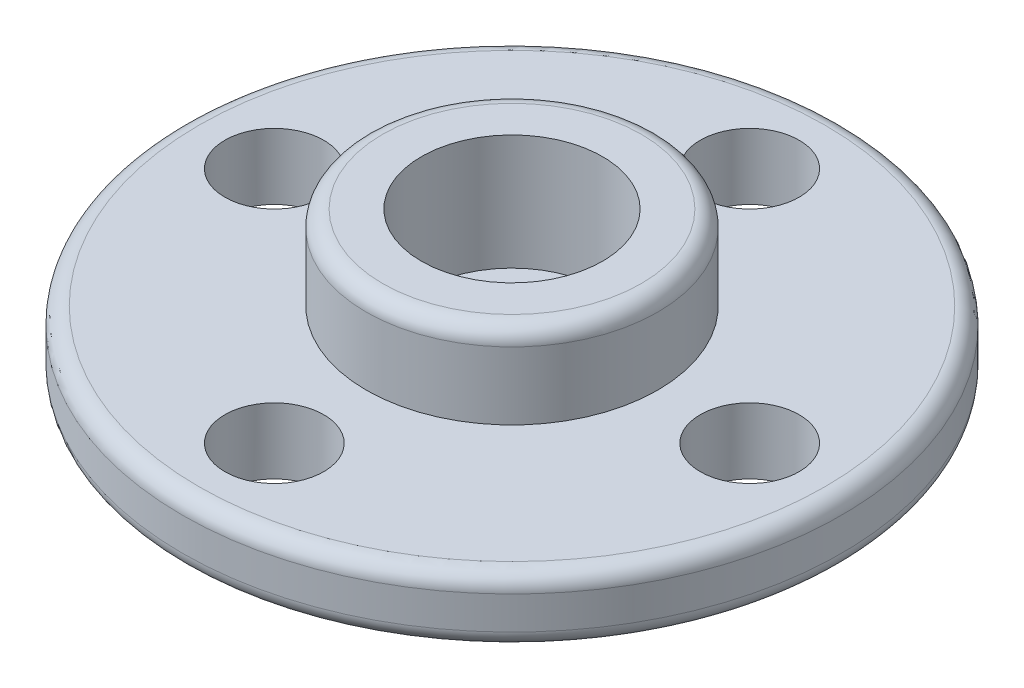
ISO-10303-21;
HEADER;
FILE_DESCRIPTION(('STEP AP214'),'2;1');
FILE_NAME('part.step','',(''),(''),'','','');
FILE_SCHEMA(('AUTOMOTIVE_DESIGN { 1 0 10303 214 1 1 1 1 }'));
ENDSEC;
DATA;
#1=APPLICATION_CONTEXT('core data for automotive mechanical design processes');
#2=APPLICATION_PROTOCOL_DEFINITION('international standard','automotive_design',2000,#1);
#3=PRODUCT_CONTEXT('',#1,'mechanical');
#4=PRODUCT('Part','Part','',(#3));
#5=PRODUCT_RELATED_PRODUCT_CATEGORY('part','',(#4));
#6=PRODUCT_DEFINITION_FORMATION('','',#4);
#7=PRODUCT_DEFINITION_CONTEXT('part definition',#1,'design');
#8=PRODUCT_DEFINITION('design','',#6,#7);
#9=PRODUCT_DEFINITION_SHAPE('','',#8);
#10=(LENGTH_UNIT() NAMED_UNIT(*) SI_UNIT(.MILLI.,.METRE.));
#11=(NAMED_UNIT(*) PLANE_ANGLE_UNIT() SI_UNIT($,.RADIAN.));
#12=(NAMED_UNIT(*) SI_UNIT($,.STERADIAN.) SOLID_ANGLE_UNIT());
#13=UNCERTAINTY_MEASURE_WITH_UNIT(LENGTH_MEASURE(1.E-05),#10,'distance_accuracy_value','');
#14=(GEOMETRIC_REPRESENTATION_CONTEXT(3) GLOBAL_UNCERTAINTY_ASSIGNED_CONTEXT((#13)) GLOBAL_UNIT_ASSIGNED_CONTEXT((#10,
#11,#12)) REPRESENTATION_CONTEXT('',''));
#15=CARTESIAN_POINT('',(0.,0.,0.));
#16=DIRECTION('',(0.,0.,1.));
#17=DIRECTION('',(1.,0.,0.));
#18=AXIS2_PLACEMENT_3D('',#15,#16,#17);
#19=CARTESIAN_POINT('',(0.,2.,0.));
#20=DIRECTION('',(0.,1.,0.));
#21=DIRECTION('',(0.,0.,1.));
#22=AXIS2_PLACEMENT_3D('',#19,#20,#21);
#23=PLANE('',#22);
#24=CARTESIAN_POINT('',(0.,2.,0.));
#25=DIRECTION('',(0.,1.,0.));
#26=DIRECTION('',(0.,0.,1.));
#27=AXIS2_PLACEMENT_3D('',#24,#25,#26);
#28=CIRCLE('',#27,9.5);
#29=CARTESIAN_POINT('',(0.,2.,9.5));
#30=VERTEX_POINT('',#29);
#31=EDGE_CURVE('E46',#30,#30,#28,.T.);
#32=ORIENTED_EDGE('',*,*,#31,.T.);
#33=EDGE_LOOP('',(#32));
#34=FACE_BOUND('',#33,.T.);
#35=CARTESIAN_POINT('',(-7.2125,2.,0.));
#36=DIRECTION('',(0.,1.,0.));
#37=DIRECTION('',(0.,0.,1.));
#38=AXIS2_PLACEMENT_3D('',#35,#36,#37);
#39=CIRCLE('',#38,1.5);
#40=CARTESIAN_POINT('',(-7.2125,2.,1.50000000000003));
#41=VERTEX_POINT('',#40);
#42=EDGE_CURVE('E78',#41,#41,#39,.T.);
#43=ORIENTED_EDGE('',*,*,#42,.F.);
#44=EDGE_LOOP('',(#43));
#45=FACE_BOUND('',#44,.T.);
#46=CARTESIAN_POINT('',(0.,2.,7.2125));
#47=DIRECTION('',(0.,1.,0.));
#48=DIRECTION('',(0.,0.,1.));
#49=AXIS2_PLACEMENT_3D('',#46,#47,#48);
#50=CIRCLE('',#49,1.5);
#51=CARTESIAN_POINT('',(0.,2.,8.7125));
#52=VERTEX_POINT('',#51);
#53=EDGE_CURVE('E81',#52,#52,#50,.T.);
#54=ORIENTED_EDGE('',*,*,#53,.F.);
#55=EDGE_LOOP('',(#54));
#56=FACE_BOUND('',#55,.T.);
#57=CARTESIAN_POINT('',(7.2125,2.,0.));
#58=DIRECTION('',(0.,1.,0.));
#59=DIRECTION('',(0.,0.,1.));
#60=AXIS2_PLACEMENT_3D('',#57,#58,#59);
#61=CIRCLE('',#60,1.5);
#62=CARTESIAN_POINT('',(7.2125,2.,1.49999999999992));
#63=VERTEX_POINT('',#62);
#64=EDGE_CURVE('E84',#63,#63,#61,.T.);
#65=ORIENTED_EDGE('',*,*,#64,.F.);
#66=EDGE_LOOP('',(#65));
#67=FACE_BOUND('',#66,.T.);
#68=CARTESIAN_POINT('',(0.,2.,-7.2125));
#69=DIRECTION('',(0.,1.,0.));
#70=DIRECTION('',(0.,0.,1.));
#71=AXIS2_PLACEMENT_3D('',#68,#69,#70);
#72=CIRCLE('',#71,1.5);
#73=CARTESIAN_POINT('',(0.,2.,-5.7125));
#74=VERTEX_POINT('',#73);
#75=EDGE_CURVE('E72',#74,#74,#72,.T.);
#76=ORIENTED_EDGE('',*,*,#75,.F.);
#77=EDGE_LOOP('',(#76));
#78=FACE_BOUND('',#77,.T.);
#79=CARTESIAN_POINT('',(0.,2.,0.));
#80=DIRECTION('',(0.,1.,0.));
#81=DIRECTION('',(0.,0.,1.));
#82=AXIS2_PLACEMENT_3D('',#79,#80,#81);
#83=CIRCLE('',#82,4.425);
#84=CARTESIAN_POINT('',(0.,2.,4.425));
#85=VERTEX_POINT('',#84);
#86=EDGE_CURVE('E57',#85,#85,#83,.T.);
#87=ORIENTED_EDGE('',*,*,#86,.F.);
#88=EDGE_LOOP('',(#87));
#89=FACE_BOUND('',#88,.T.);
#90=ADVANCED_FACE('F31',(#34,#45,#56,#67,#78,#89),#23,.T.);
#91=CARTESIAN_POINT('',(0.,0.,0.));
#92=DIRECTION('',(0.,1.,0.));
#93=DIRECTION('',(0.,0.,1.));
#94=AXIS2_PLACEMENT_3D('',#91,#92,#93);
#95=PLANE('',#94);
#96=CARTESIAN_POINT('',(0.,0.,0.));
#97=DIRECTION('',(0.,1.,0.));
#98=DIRECTION('',(0.,0.,1.));
#99=AXIS2_PLACEMENT_3D('',#96,#97,#98);
#100=CIRCLE('',#99,9.5);
#101=CARTESIAN_POINT('',(0.,0.,9.5));
#102=VERTEX_POINT('',#101);
#103=EDGE_CURVE('E10',#102,#102,#100,.F.);
#104=ORIENTED_EDGE('',*,*,#103,.T.);
#105=EDGE_LOOP('',(#104));
#106=FACE_BOUND('',#105,.T.);
#107=CARTESIAN_POINT('',(-7.2125,0.,0.));
#108=DIRECTION('',(0.,1.,0.));
#109=DIRECTION('',(1.,0.,0.));
#110=AXIS2_PLACEMENT_3D('',#107,#108,#109);
#111=CIRCLE('',#110,1.5);
#112=CARTESIAN_POINT('',(-5.7125,0.,0.));
#113=VERTEX_POINT('',#112);
#114=EDGE_CURVE('E87',#113,#113,#111,.T.);
#115=ORIENTED_EDGE('',*,*,#114,.T.);
#116=EDGE_LOOP('',(#115));
#117=FACE_BOUND('',#116,.T.);
#118=CARTESIAN_POINT('',(0.,0.,7.2125));
#119=DIRECTION('',(0.,1.,0.));
#120=DIRECTION('',(0.,0.,-1.));
#121=AXIS2_PLACEMENT_3D('',#118,#119,#120);
#122=CIRCLE('',#121,1.5);
#123=CARTESIAN_POINT('',(0.,0.,5.7125));
#124=VERTEX_POINT('',#123);
#125=EDGE_CURVE('E91',#124,#124,#122,.T.);
#126=ORIENTED_EDGE('',*,*,#125,.T.);
#127=EDGE_LOOP('',(#126));
#128=FACE_BOUND('',#127,.T.);
#129=CARTESIAN_POINT('',(7.2125,0.,0.));
#130=DIRECTION('',(0.,1.,0.));
#131=DIRECTION('',(-1.,0.,0.));
#132=AXIS2_PLACEMENT_3D('',#129,#130,#131);
#133=CIRCLE('',#132,1.5);
#134=CARTESIAN_POINT('',(5.7125,0.,0.));
#135=VERTEX_POINT('',#134);
#136=EDGE_CURVE('E88',#135,#135,#133,.T.);
#137=ORIENTED_EDGE('',*,*,#136,.T.);
#138=EDGE_LOOP('',(#137));
#139=FACE_BOUND('',#138,.T.);
#140=CARTESIAN_POINT('',(0.,0.,-7.2125));
#141=DIRECTION('',(0.,1.,0.));
#142=DIRECTION('',(0.,0.,1.));
#143=AXIS2_PLACEMENT_3D('',#140,#141,#142);
#144=CIRCLE('',#143,1.5);
#145=CARTESIAN_POINT('',(0.,0.,-5.7125));
#146=VERTEX_POINT('',#145);
#147=EDGE_CURVE('E75',#146,#146,#144,.T.);
#148=ORIENTED_EDGE('',*,*,#147,.T.);
#149=EDGE_LOOP('',(#148));
#150=FACE_BOUND('',#149,.T.);
#151=CARTESIAN_POINT('',(0.,0.,0.));
#152=DIRECTION('',(0.,1.,0.));
#153=DIRECTION('',(0.,0.,1.));
#154=AXIS2_PLACEMENT_3D('',#151,#152,#153);
#155=CIRCLE('',#154,1.5);
#156=CARTESIAN_POINT('',(0.,0.,1.5));
#157=VERTEX_POINT('',#156);
#158=EDGE_CURVE('E62',#157,#157,#155,.T.);
#159=ORIENTED_EDGE('',*,*,#158,.T.);
#160=EDGE_LOOP('',(#159));
#161=FACE_BOUND('',#160,.T.);
#162=ADVANCED_FACE('F97',(#106,#117,#128,#139,#150,#161),#95,.F.);
#163=CARTESIAN_POINT('',(0.,2.,0.));
#164=DIRECTION('',(0.,-1.,0.));
#165=DIRECTION('',(0.,0.,-1.));
#166=AXIS2_PLACEMENT_3D('',#163,#164,#165);
#167=CYLINDRICAL_SURFACE('',#166,10.);
#168=CARTESIAN_POINT('',(0.,1.5,0.));
#169=DIRECTION('',(0.,1.,0.));
#170=DIRECTION('',(0.,0.,1.));
#171=AXIS2_PLACEMENT_3D('',#168,#169,#170);
#172=CIRCLE('',#171,10.);
#173=CARTESIAN_POINT('',(0.,1.5,10.));
#174=VERTEX_POINT('',#173);
#175=EDGE_CURVE('E38',#174,#174,#172,.F.);
#176=ORIENTED_EDGE('',*,*,#175,.T.);
#177=EDGE_LOOP('',(#176));
#178=FACE_BOUND('',#177,.T.);
#179=CARTESIAN_POINT('',(0.,0.5,0.));
#180=DIRECTION('',(0.,1.,0.));
#181=DIRECTION('',(0.,0.,1.));
#182=AXIS2_PLACEMENT_3D('',#179,#180,#181);
#183=CIRCLE('',#182,10.);
#184=CARTESIAN_POINT('',(0.,0.5,10.));
#185=VERTEX_POINT('',#184);
#186=EDGE_CURVE('E42',#185,#185,#183,.T.);
#187=ORIENTED_EDGE('',*,*,#186,.T.);
#188=EDGE_LOOP('',(#187));
#189=FACE_BOUND('',#188,.T.);
#190=ADVANCED_FACE('F122',(#178,#189),#167,.T.);
#191=CARTESIAN_POINT('',(0.,4.55,0.));
#192=DIRECTION('',(0.,-1.,0.));
#193=DIRECTION('',(0.,0.,-1.));
#194=AXIS2_PLACEMENT_3D('',#191,#192,#193);
#195=CYLINDRICAL_SURFACE('',#194,4.425);
#196=CARTESIAN_POINT('',(0.,4.05,0.));
#197=DIRECTION('',(0.,1.,0.));
#198=DIRECTION('',(0.,0.,1.));
#199=AXIS2_PLACEMENT_3D('',#196,#197,#198);
#200=CIRCLE('',#199,4.425);
#201=CARTESIAN_POINT('',(0.,4.05,4.425));
#202=VERTEX_POINT('',#201);
#203=EDGE_CURVE('E51',#202,#202,#200,.F.);
#204=ORIENTED_EDGE('',*,*,#203,.T.);
#205=EDGE_LOOP('',(#204));
#206=FACE_BOUND('',#205,.T.);
#207=ORIENTED_EDGE('',*,*,#86,.T.);
#208=EDGE_LOOP('',(#207));
#209=FACE_BOUND('',#208,.T.);
#210=ADVANCED_FACE('F126',(#206,#209),#195,.T.);
#211=CARTESIAN_POINT('',(0.,4.55,0.));
#212=DIRECTION('',(0.,1.,0.));
#213=DIRECTION('',(0.,0.,1.));
#214=AXIS2_PLACEMENT_3D('',#211,#212,#213);
#215=PLANE('',#214);
#216=CARTESIAN_POINT('',(0.,4.55,0.));
#217=DIRECTION('',(0.,1.,0.));
#218=DIRECTION('',(0.,0.,1.));
#219=AXIS2_PLACEMENT_3D('',#216,#217,#218);
#220=CIRCLE('',#219,3.925);
#221=CARTESIAN_POINT('',(0.,4.55,3.925));
#222=VERTEX_POINT('',#221);
#223=EDGE_CURVE('E54',#222,#222,#220,.T.);
#224=ORIENTED_EDGE('',*,*,#223,.T.);
#225=EDGE_LOOP('',(#224));
#226=FACE_BOUND('',#225,.T.);
#227=CARTESIAN_POINT('',(0.,4.55,0.));
#228=DIRECTION('',(0.,1.,0.));
#229=DIRECTION('',(0.,0.,1.));
#230=AXIS2_PLACEMENT_3D('',#227,#228,#229);
#231=CIRCLE('',#230,2.75);
#232=CARTESIAN_POINT('',(0.,4.55,2.75));
#233=VERTEX_POINT('',#232);
#234=EDGE_CURVE('E61',#233,#233,#231,.T.);
#235=ORIENTED_EDGE('',*,*,#234,.F.);
#236=EDGE_LOOP('',(#235));
#237=FACE_BOUND('',#236,.T.);
#238=ADVANCED_FACE('F159',(#226,#237),#215,.T.);
#239=CARTESIAN_POINT('',(0.,1.05,0.));
#240=DIRECTION('',(0.,1.,0.));
#241=DIRECTION('',(0.,0.,1.));
#242=AXIS2_PLACEMENT_3D('',#239,#240,#241);
#243=CYLINDRICAL_SURFACE('',#242,2.75);
#244=CARTESIAN_POINT('',(0.,1.05,0.));
#245=DIRECTION('',(0.,1.,0.));
#246=DIRECTION('',(0.,0.,1.));
#247=AXIS2_PLACEMENT_3D('',#244,#245,#246);
#248=CIRCLE('',#247,2.75);
#249=CARTESIAN_POINT('',(0.,1.05,2.75));
#250=VERTEX_POINT('',#249);
#251=EDGE_CURVE('E65',#250,#250,#248,.T.);
#252=ORIENTED_EDGE('',*,*,#251,.F.);
#253=EDGE_LOOP('',(#252));
#254=FACE_BOUND('',#253,.T.);
#255=ORIENTED_EDGE('',*,*,#234,.T.);
#256=EDGE_LOOP('',(#255));
#257=FACE_BOUND('',#256,.T.);
#258=ADVANCED_FACE('F163',(#254,#257),#243,.F.);
#259=CARTESIAN_POINT('',(0.,1.05,0.));
#260=DIRECTION('',(0.,1.,0.));
#261=DIRECTION('',(0.,0.,1.));
#262=AXIS2_PLACEMENT_3D('',#259,#260,#261);
#263=PLANE('',#262);
#264=CARTESIAN_POINT('',(0.,1.05,0.));
#265=DIRECTION('',(0.,1.,0.));
#266=DIRECTION('',(0.,0.,1.));
#267=AXIS2_PLACEMENT_3D('',#264,#265,#266);
#268=CIRCLE('',#267,1.5);
#269=CARTESIAN_POINT('',(0.,1.05,1.5));
#270=VERTEX_POINT('',#269);
#271=EDGE_CURVE('E58',#270,#270,#268,.T.);
#272=ORIENTED_EDGE('',*,*,#271,.F.);
#273=EDGE_LOOP('',(#272));
#274=FACE_BOUND('',#273,.T.);
#275=ORIENTED_EDGE('',*,*,#251,.T.);
#276=EDGE_LOOP('',(#275));
#277=FACE_BOUND('',#276,.T.);
#278=ADVANCED_FACE('F201',(#274,#277),#263,.T.);
#279=CARTESIAN_POINT('',(0.,0.,0.));
#280=DIRECTION('',(0.,1.,0.));
#281=DIRECTION('',(0.,0.,1.));
#282=AXIS2_PLACEMENT_3D('',#279,#280,#281);
#283=CYLINDRICAL_SURFACE('',#282,1.5);
#284=ORIENTED_EDGE('',*,*,#271,.T.);
#285=EDGE_LOOP('',(#284));
#286=FACE_BOUND('',#285,.T.);
#287=ORIENTED_EDGE('',*,*,#158,.F.);
#288=EDGE_LOOP('',(#287));
#289=FACE_BOUND('',#288,.T.);
#290=ADVANCED_FACE('F210',(#286,#289),#283,.F.);
#291=CARTESIAN_POINT('',(0.,0.,-7.2125));
#292=DIRECTION('',(0.,1.,0.));
#293=DIRECTION('',(0.,0.,1.));
#294=AXIS2_PLACEMENT_3D('',#291,#292,#293);
#295=CYLINDRICAL_SURFACE('',#294,1.5);
#296=ORIENTED_EDGE('',*,*,#75,.T.);
#297=EDGE_LOOP('',(#296));
#298=FACE_BOUND('',#297,.T.);
#299=ORIENTED_EDGE('',*,*,#147,.F.);
#300=EDGE_LOOP('',(#299));
#301=FACE_BOUND('',#300,.T.);
#302=ADVANCED_FACE('F219',(#298,#301),#295,.F.);
#303=CARTESIAN_POINT('',(7.2125,0.,0.));
#304=DIRECTION('',(0.,1.,0.));
#305=DIRECTION('',(0.,0.,1.));
#306=AXIS2_PLACEMENT_3D('',#303,#304,#305);
#307=CYLINDRICAL_SURFACE('',#306,1.5);
#308=ORIENTED_EDGE('',*,*,#64,.T.);
#309=EDGE_LOOP('',(#308));
#310=FACE_BOUND('',#309,.T.);
#311=ORIENTED_EDGE('',*,*,#136,.F.);
#312=EDGE_LOOP('',(#311));
#313=FACE_BOUND('',#312,.T.);
#314=ADVANCED_FACE('F113',(#310,#313),#307,.F.);
#315=CARTESIAN_POINT('',(0.,0.,7.2125));
#316=DIRECTION('',(0.,1.,0.));
#317=DIRECTION('',(0.,0.,1.));
#318=AXIS2_PLACEMENT_3D('',#315,#316,#317);
#319=CYLINDRICAL_SURFACE('',#318,1.5);
#320=ORIENTED_EDGE('',*,*,#53,.T.);
#321=EDGE_LOOP('',(#320));
#322=FACE_BOUND('',#321,.T.);
#323=ORIENTED_EDGE('',*,*,#125,.F.);
#324=EDGE_LOOP('',(#323));
#325=FACE_BOUND('',#324,.T.);
#326=ADVANCED_FACE('F103',(#322,#325),#319,.F.);
#327=CARTESIAN_POINT('',(-7.2125,0.,0.));
#328=DIRECTION('',(0.,1.,0.));
#329=DIRECTION('',(0.,0.,1.));
#330=AXIS2_PLACEMENT_3D('',#327,#328,#329);
#331=CYLINDRICAL_SURFACE('',#330,1.5);
#332=ORIENTED_EDGE('',*,*,#42,.T.);
#333=EDGE_LOOP('',(#332));
#334=FACE_BOUND('',#333,.T.);
#335=ORIENTED_EDGE('',*,*,#114,.F.);
#336=EDGE_LOOP('',(#335));
#337=FACE_BOUND('',#336,.T.);
#338=ADVANCED_FACE('F100',(#334,#337),#331,.F.);
#339=CARTESIAN_POINT('',(0.,4.05,0.));
#340=DIRECTION('',(0.,1.,0.));
#341=DIRECTION('',(0.,0.,1.));
#342=AXIS2_PLACEMENT_3D('',#339,#340,#341);
#343=TOROIDAL_SURFACE('',#342,3.925,0.5);
#344=ORIENTED_EDGE('',*,*,#203,.F.);
#345=EDGE_LOOP('',(#344));
#346=FACE_BOUND('',#345,.T.);
#347=ORIENTED_EDGE('',*,*,#223,.F.);
#348=EDGE_LOOP('',(#347));
#349=FACE_BOUND('',#348,.T.);
#350=ADVANCED_FACE('F102',(#346,#349),#343,.T.);
#351=CARTESIAN_POINT('',(0.,1.5,0.));
#352=DIRECTION('',(0.,1.,0.));
#353=DIRECTION('',(0.,0.,1.));
#354=AXIS2_PLACEMENT_3D('',#351,#352,#353);
#355=TOROIDAL_SURFACE('',#354,9.5,0.5);
#356=ORIENTED_EDGE('',*,*,#175,.F.);
#357=EDGE_LOOP('',(#356));
#358=FACE_BOUND('',#357,.T.);
#359=ORIENTED_EDGE('',*,*,#31,.F.);
#360=EDGE_LOOP('',(#359));
#361=FACE_BOUND('',#360,.T.);
#362=ADVANCED_FACE('F110',(#358,#361),#355,.T.);
#363=CARTESIAN_POINT('',(0.,0.5,0.));
#364=DIRECTION('',(0.,1.,0.));
#365=DIRECTION('',(0.,0.,1.));
#366=AXIS2_PLACEMENT_3D('',#363,#364,#365);
#367=TOROIDAL_SURFACE('',#366,9.5,0.5);
#368=ORIENTED_EDGE('',*,*,#103,.F.);
#369=EDGE_LOOP('',(#368));
#370=FACE_BOUND('',#369,.T.);
#371=ORIENTED_EDGE('',*,*,#186,.F.);
#372=EDGE_LOOP('',(#371));
#373=FACE_BOUND('',#372,.T.);
#374=ADVANCED_FACE('F33',(#370,#373),#367,.T.);
#375=CLOSED_SHELL('',(#90,#162,#190,#210,#238,#258,#278,#290,#302,#314,#326,#338,#350,#362,#374));
#376=MANIFOLD_SOLID_BREP('B2',#375);
#377=ADVANCED_BREP_SHAPE_REPRESENTATION('',(#18,#376),#14);
#378=SHAPE_DEFINITION_REPRESENTATION(#9,#377);
ENDSEC;
END-ISO-10303-21;
